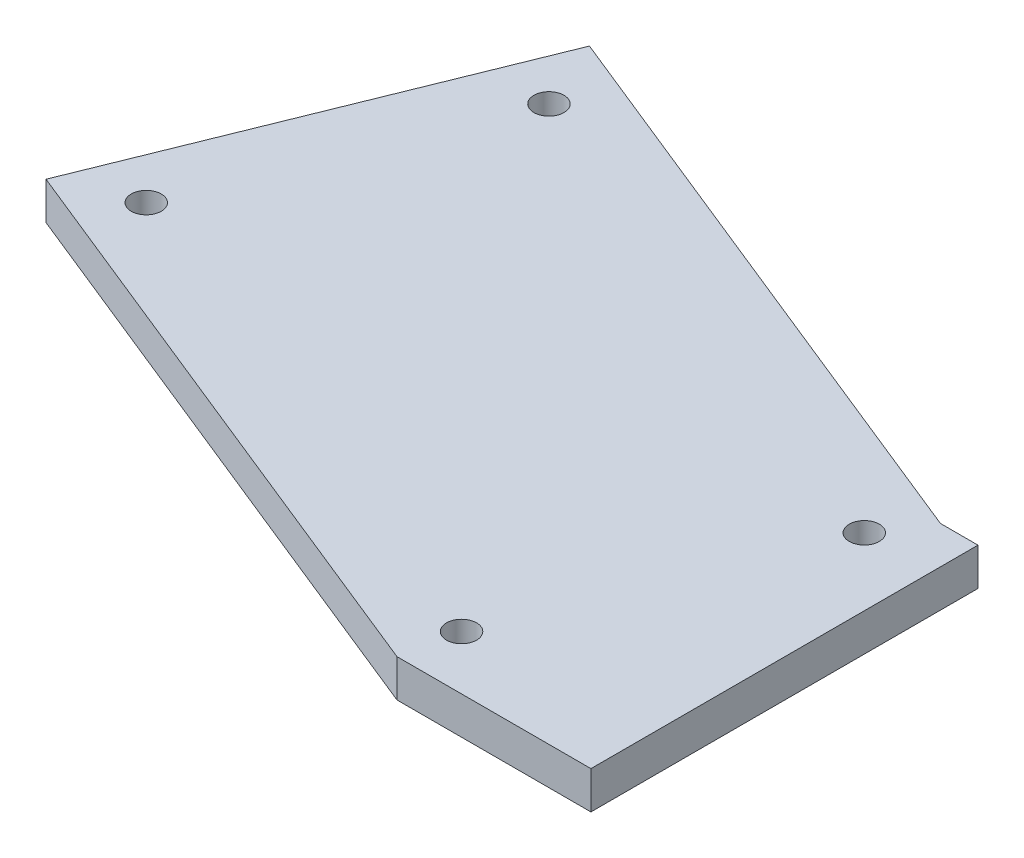
ISO-10303-21;
HEADER;
FILE_DESCRIPTION(('STEP AP214'),'2;1');
FILE_NAME('part.step','',(''),(''),'','','');
FILE_SCHEMA(('AUTOMOTIVE_DESIGN { 1 0 10303 214 1 1 1 1 }'));
ENDSEC;
DATA;
#1=APPLICATION_CONTEXT('core data for automotive mechanical design processes');
#2=APPLICATION_PROTOCOL_DEFINITION('international standard','automotive_design',2000,#1);
#3=PRODUCT_CONTEXT('',#1,'mechanical');
#4=PRODUCT('Part','Part','',(#3));
#5=PRODUCT_RELATED_PRODUCT_CATEGORY('part','',(#4));
#6=PRODUCT_DEFINITION_FORMATION('','',#4);
#7=PRODUCT_DEFINITION_CONTEXT('part definition',#1,'design');
#8=PRODUCT_DEFINITION('design','',#6,#7);
#9=PRODUCT_DEFINITION_SHAPE('','',#8);
#10=(LENGTH_UNIT() NAMED_UNIT(*) SI_UNIT(.MILLI.,.METRE.));
#11=(NAMED_UNIT(*) PLANE_ANGLE_UNIT() SI_UNIT($,.RADIAN.));
#12=(NAMED_UNIT(*) SI_UNIT($,.STERADIAN.) SOLID_ANGLE_UNIT());
#13=UNCERTAINTY_MEASURE_WITH_UNIT(LENGTH_MEASURE(1.E-05),#10,'distance_accuracy_value','');
#14=(GEOMETRIC_REPRESENTATION_CONTEXT(3) GLOBAL_UNCERTAINTY_ASSIGNED_CONTEXT((#13)) GLOBAL_UNIT_ASSIGNED_CONTEXT((#10,
#11,#12)) REPRESENTATION_CONTEXT('',''));
#15=CARTESIAN_POINT('',(0.,0.,0.));
#16=DIRECTION('',(0.,0.,1.));
#17=DIRECTION('',(1.,0.,0.));
#18=AXIS2_PLACEMENT_3D('',#15,#16,#17);
#19=CARTESIAN_POINT('',(0.,3.175,0.));
#20=DIRECTION('',(0.,-1.,0.));
#21=DIRECTION('',(0.,0.,-1.));
#22=AXIS2_PLACEMENT_3D('',#19,#20,#21);
#23=PLANE('',#22);
#24=CARTESIAN_POINT('',(-15.5121536137644,3.175,28.1631531693351));
#25=DIRECTION('',(0.,1.,0.));
#26=DIRECTION('',(0.,0.,1.));
#27=AXIS2_PLACEMENT_3D('',#24,#25,#26);
#28=CIRCLE('',#27,1.27);
#29=CARTESIAN_POINT('',(-15.5121536137644,3.175,29.4331531693351));
#30=VERTEX_POINT('',#29);
#31=EDGE_CURVE('E210',#30,#30,#28,.T.);
#32=ORIENTED_EDGE('',*,*,#31,.F.);
#33=EDGE_LOOP('',(#32));
#34=FACE_BOUND('',#33,.T.);
#35=CARTESIAN_POINT('',(-50.4575887382106,3.175,-14.1723450320931));
#36=DIRECTION('',(0.,1.,0.));
#37=DIRECTION('',(0.,0.,1.));
#38=AXIS2_PLACEMENT_3D('',#35,#36,#37);
#39=CIRCLE('',#38,1.27000000000001);
#40=CARTESIAN_POINT('',(-50.4575887382106,3.175,-12.902345032093));
#41=VERTEX_POINT('',#40);
#42=EDGE_CURVE('E132',#41,#41,#39,.T.);
#43=ORIENTED_EDGE('',*,*,#42,.F.);
#44=EDGE_LOOP('',(#43));
#45=FACE_BOUND('',#44,.T.);
#46=DIRECTION('',(0.,0.,-1.));
#47=VECTOR('',#46,1.);
#48=CARTESIAN_POINT('',(0.,3.175,0.));
#49=LINE('',#48,#47);
#50=CARTESIAN_POINT('',(0.,3.175,32.7351531693348));
#51=VERTEX_POINT('',#50);
#52=CARTESIAN_POINT('',(0.,3.175,0.));
#53=VERTEX_POINT('',#52);
#54=EDGE_CURVE('E141',#51,#53,#49,.T.);
#55=ORIENTED_EDGE('',*,*,#54,.T.);
#56=DIRECTION('',(-1.,0.,0.));
#57=VECTOR('',#56,1.);
#58=CARTESIAN_POINT('',(0.,3.175,0.));
#59=LINE('',#58,#57);
#60=CARTESIAN_POINT('',(-3.175,3.175,0.));
#61=VERTEX_POINT('',#60);
#62=EDGE_CURVE('E94',#53,#61,#59,.T.);
#63=ORIENTED_EDGE('',*,*,#62,.T.);
#64=DIRECTION('',(-0.927183854566788,0.,-0.374606593415909));
#65=VECTOR('',#64,1.);
#66=CARTESIAN_POINT('',(-3.175,3.175,0.));
#67=LINE('',#66,#65);
#68=CARTESIAN_POINT('',(-52.9839719761924,3.175,-20.12413096027));
#69=VERTEX_POINT('',#68);
#70=EDGE_CURVE('E107',#61,#69,#67,.T.);
#71=ORIENTED_EDGE('',*,*,#70,.T.);
#72=DIRECTION('',(-0.374606593415909,0.,0.927183854566789));
#73=VECTOR('',#72,1.);
#74=CARTESIAN_POINT('',(-52.9839719761924,3.175,-20.12413096027));
#75=LINE('',#74,#73);
#76=CARTESIAN_POINT('',(-66.2098323633345,3.175,12.6110222090651));
#77=VERTEX_POINT('',#76);
#78=EDGE_CURVE('E101',#69,#77,#75,.T.);
#79=ORIENTED_EDGE('',*,*,#78,.T.);
#80=DIRECTION('',(0.927183854566788,0.,0.37460659341591));
#81=VECTOR('',#80,1.);
#82=CARTESIAN_POINT('',(-66.2098323633345,3.175,12.6110222090651));
#83=LINE('',#82,#81);
#84=CARTESIAN_POINT('',(-16.4008603871421,3.175,32.7351531693351));
#85=VERTEX_POINT('',#84);
#86=EDGE_CURVE('E105',#77,#85,#83,.T.);
#87=ORIENTED_EDGE('',*,*,#86,.T.);
#88=DIRECTION('',(1.,0.,0.));
#89=VECTOR('',#88,1.);
#90=CARTESIAN_POINT('',(0.,3.175,32.7351531693348));
#91=LINE('',#90,#89);
#92=EDGE_CURVE('E57',#85,#51,#91,.T.);
#93=ORIENTED_EDGE('',*,*,#92,.T.);
#94=EDGE_LOOP('',(#55,#63,#71,#79,#87,#93));
#95=FACE_BOUND('',#94,.T.);
#96=CARTESIAN_POINT('',(-60.2580464351576,3.175,10.0846389710833));
#97=DIRECTION('',(0.,1.,0.));
#98=DIRECTION('',(0.,0.,1.));
#99=AXIS2_PLACEMENT_3D('',#96,#97,#98);
#100=CIRCLE('',#99,1.27000000000006);
#101=CARTESIAN_POINT('',(-60.2580464351576,3.175,11.3546389710833));
#102=VERTEX_POINT('',#101);
#103=EDGE_CURVE('E216',#102,#102,#100,.T.);
#104=ORIENTED_EDGE('',*,*,#103,.F.);
#105=EDGE_LOOP('',(#104));
#106=FACE_BOUND('',#105,.T.);
#107=CARTESIAN_POINT('',(-5.7116959168174,3.175,3.90616916615873));
#108=DIRECTION('',(0.,1.,0.));
#109=DIRECTION('',(0.,0.,1.));
#110=AXIS2_PLACEMENT_3D('',#107,#108,#109);
#111=CIRCLE('',#110,1.27);
#112=CARTESIAN_POINT('',(-5.7116959168174,3.175,5.17616916615873));
#113=VERTEX_POINT('',#112);
#114=EDGE_CURVE('E198',#113,#113,#111,.T.);
#115=ORIENTED_EDGE('',*,*,#114,.F.);
#116=EDGE_LOOP('',(#115));
#117=FACE_BOUND('',#116,.T.);
#118=ADVANCED_FACE('F39',(#34,#45,#95,#106,#117),#23,.F.);
#119=CARTESIAN_POINT('',(0.,0.,0.));
#120=DIRECTION('',(0.,-1.,0.));
#121=DIRECTION('',(0.,0.,-1.));
#122=AXIS2_PLACEMENT_3D('',#119,#120,#121);
#123=PLANE('',#122);
#124=CARTESIAN_POINT('',(-15.5121536137644,0.,28.1631531693351));
#125=DIRECTION('',(0.,1.,0.));
#126=DIRECTION('',(0.,0.,1.));
#127=AXIS2_PLACEMENT_3D('',#124,#125,#126);
#128=CIRCLE('',#127,1.27);
#129=CARTESIAN_POINT('',(-15.5121536137644,0.,29.4331531693351));
#130=VERTEX_POINT('',#129);
#131=EDGE_CURVE('E207',#130,#130,#128,.T.);
#132=ORIENTED_EDGE('',*,*,#131,.T.);
#133=EDGE_LOOP('',(#132));
#134=FACE_BOUND('',#133,.T.);
#135=CARTESIAN_POINT('',(-50.4575887382106,0.,-14.1723450320931));
#136=DIRECTION('',(0.,1.,0.));
#137=DIRECTION('',(0.,0.,1.));
#138=AXIS2_PLACEMENT_3D('',#135,#136,#137);
#139=CIRCLE('',#138,1.27000000000001);
#140=CARTESIAN_POINT('',(-50.4575887382106,0.,-12.902345032093));
#141=VERTEX_POINT('',#140);
#142=EDGE_CURVE('E219',#141,#141,#139,.T.);
#143=ORIENTED_EDGE('',*,*,#142,.T.);
#144=EDGE_LOOP('',(#143));
#145=FACE_BOUND('',#144,.T.);
#146=DIRECTION('',(0.,0.,-1.));
#147=VECTOR('',#146,1.);
#148=CARTESIAN_POINT('',(0.,0.,0.));
#149=LINE('',#148,#147);
#150=CARTESIAN_POINT('',(0.,0.,32.7351531693348));
#151=VERTEX_POINT('',#150);
#152=CARTESIAN_POINT('',(0.,0.,0.));
#153=VERTEX_POINT('',#152);
#154=EDGE_CURVE('E127',#151,#153,#149,.T.);
#155=ORIENTED_EDGE('',*,*,#154,.F.);
#156=DIRECTION('',(1.,0.,0.));
#157=VECTOR('',#156,1.);
#158=CARTESIAN_POINT('',(0.,0.,32.7351531693348));
#159=LINE('',#158,#157);
#160=CARTESIAN_POINT('',(-16.4008603871421,0.,32.7351531693351));
#161=VERTEX_POINT('',#160);
#162=EDGE_CURVE('E86',#161,#151,#159,.T.);
#163=ORIENTED_EDGE('',*,*,#162,.F.);
#164=DIRECTION('',(0.927183854566788,0.,0.37460659341591));
#165=VECTOR('',#164,1.);
#166=CARTESIAN_POINT('',(-66.2098323633345,0.,12.6110222090651));
#167=LINE('',#166,#165);
#168=CARTESIAN_POINT('',(-66.2098323633345,0.,12.6110222090651));
#169=VERTEX_POINT('',#168);
#170=EDGE_CURVE('E80',#169,#161,#167,.T.);
#171=ORIENTED_EDGE('',*,*,#170,.F.);
#172=DIRECTION('',(-0.374606593415909,0.,0.927183854566789));
#173=VECTOR('',#172,1.);
#174=CARTESIAN_POINT('',(-52.9839719761924,0.,-20.12413096027));
#175=LINE('',#174,#173);
#176=CARTESIAN_POINT('',(-52.9839719761924,0.,-20.12413096027));
#177=VERTEX_POINT('',#176);
#178=EDGE_CURVE('E115',#177,#169,#175,.T.);
#179=ORIENTED_EDGE('',*,*,#178,.F.);
#180=DIRECTION('',(-0.927183854566788,0.,-0.374606593415909));
#181=VECTOR('',#180,1.);
#182=CARTESIAN_POINT('',(-3.175,0.,0.));
#183=LINE('',#182,#181);
#184=CARTESIAN_POINT('',(-3.175,0.,0.));
#185=VERTEX_POINT('',#184);
#186=EDGE_CURVE('E135',#185,#177,#183,.T.);
#187=ORIENTED_EDGE('',*,*,#186,.F.);
#188=DIRECTION('',(-1.,0.,0.));
#189=VECTOR('',#188,1.);
#190=CARTESIAN_POINT('',(0.,0.,0.));
#191=LINE('',#190,#189);
#192=EDGE_CURVE('E131',#153,#185,#191,.T.);
#193=ORIENTED_EDGE('',*,*,#192,.F.);
#194=EDGE_LOOP('',(#155,#163,#171,#179,#187,#193));
#195=FACE_BOUND('',#194,.T.);
#196=CARTESIAN_POINT('',(-60.2580464351576,0.,10.0846389710833));
#197=DIRECTION('',(0.,1.,0.));
#198=DIRECTION('',(0.,0.,1.));
#199=AXIS2_PLACEMENT_3D('',#196,#197,#198);
#200=CIRCLE('',#199,1.27000000000006);
#201=CARTESIAN_POINT('',(-60.2580464351576,0.,11.3546389710833));
#202=VERTEX_POINT('',#201);
#203=EDGE_CURVE('E213',#202,#202,#200,.T.);
#204=ORIENTED_EDGE('',*,*,#203,.T.);
#205=EDGE_LOOP('',(#204));
#206=FACE_BOUND('',#205,.T.);
#207=CARTESIAN_POINT('',(-5.7116959168174,0.,3.90616916615873));
#208=DIRECTION('',(0.,1.,0.));
#209=DIRECTION('',(0.,0.,1.));
#210=AXIS2_PLACEMENT_3D('',#207,#208,#209);
#211=CIRCLE('',#210,1.27);
#212=CARTESIAN_POINT('',(-5.7116959168174,0.,5.17616916615873));
#213=VERTEX_POINT('',#212);
#214=EDGE_CURVE('E201',#213,#213,#211,.T.);
#215=ORIENTED_EDGE('',*,*,#214,.T.);
#216=EDGE_LOOP('',(#215));
#217=FACE_BOUND('',#216,.T.);
#218=ADVANCED_FACE('F155',(#134,#145,#195,#206,#217),#123,.T.);
#219=CARTESIAN_POINT('',(0.,3.175,0.));
#220=DIRECTION('',(-1.,0.,0.));
#221=DIRECTION('',(0.,0.,1.));
#222=AXIS2_PLACEMENT_3D('',#219,#220,#221);
#223=PLANE('',#222);
#224=ORIENTED_EDGE('',*,*,#154,.T.);
#225=DIRECTION('',(0.,-1.,0.));
#226=VECTOR('',#225,1.);
#227=CARTESIAN_POINT('',(0.,3.175,0.));
#228=LINE('',#227,#226);
#229=EDGE_CURVE('E11',#53,#153,#228,.T.);
#230=ORIENTED_EDGE('',*,*,#229,.F.);
#231=ORIENTED_EDGE('',*,*,#54,.F.);
#232=DIRECTION('',(0.,-1.,0.));
#233=VECTOR('',#232,1.);
#234=CARTESIAN_POINT('',(0.,3.175,32.7351531693348));
#235=LINE('',#234,#233);
#236=EDGE_CURVE('E123',#51,#151,#235,.T.);
#237=ORIENTED_EDGE('',*,*,#236,.T.);
#238=EDGE_LOOP('',(#224,#230,#231,#237));
#239=FACE_BOUND('',#238,.T.);
#240=ADVANCED_FACE('F41',(#239),#223,.F.);
#241=CARTESIAN_POINT('',(0.,3.175,0.));
#242=DIRECTION('',(0.,0.,1.));
#243=DIRECTION('',(1.,0.,0.));
#244=AXIS2_PLACEMENT_3D('',#241,#242,#243);
#245=PLANE('',#244);
#246=ORIENTED_EDGE('',*,*,#192,.T.);
#247=DIRECTION('',(0.,-1.,0.));
#248=VECTOR('',#247,1.);
#249=CARTESIAN_POINT('',(-3.175,3.175,0.));
#250=LINE('',#249,#248);
#251=EDGE_CURVE('E49',#61,#185,#250,.T.);
#252=ORIENTED_EDGE('',*,*,#251,.F.);
#253=ORIENTED_EDGE('',*,*,#62,.F.);
#254=ORIENTED_EDGE('',*,*,#229,.T.);
#255=EDGE_LOOP('',(#246,#252,#253,#254));
#256=FACE_BOUND('',#255,.T.);
#257=ADVANCED_FACE('F283',(#256),#245,.F.);
#258=CARTESIAN_POINT('',(-3.175,3.175,0.));
#259=DIRECTION('',(-0.374606593415909,0.,0.927183854566788));
#260=DIRECTION('',(0.927183854566789,0.,0.37460659341591));
#261=AXIS2_PLACEMENT_3D('',#258,#259,#260);
#262=PLANE('',#261);
#263=ORIENTED_EDGE('',*,*,#186,.T.);
#264=DIRECTION('',(0.,-1.,0.));
#265=VECTOR('',#264,1.);
#266=CARTESIAN_POINT('',(-52.9839719761924,3.175,-20.12413096027));
#267=LINE('',#266,#265);
#268=EDGE_CURVE('E117',#69,#177,#267,.T.);
#269=ORIENTED_EDGE('',*,*,#268,.F.);
#270=ORIENTED_EDGE('',*,*,#70,.F.);
#271=ORIENTED_EDGE('',*,*,#251,.T.);
#272=EDGE_LOOP('',(#263,#269,#270,#271));
#273=FACE_BOUND('',#272,.T.);
#274=ADVANCED_FACE('F152',(#273),#262,.F.);
#275=CARTESIAN_POINT('',(-52.9839719761924,3.175,-20.12413096027));
#276=DIRECTION('',(0.927183854566789,0.,0.374606593415909));
#277=DIRECTION('',(0.374606593415909,0.,-0.927183854566789));
#278=AXIS2_PLACEMENT_3D('',#275,#276,#277);
#279=PLANE('',#278);
#280=ORIENTED_EDGE('',*,*,#178,.T.);
#281=DIRECTION('',(0.,-1.,0.));
#282=VECTOR('',#281,1.);
#283=CARTESIAN_POINT('',(-66.2098323633345,3.175,12.6110222090651));
#284=LINE('',#283,#282);
#285=EDGE_CURVE('E112',#77,#169,#284,.T.);
#286=ORIENTED_EDGE('',*,*,#285,.F.);
#287=ORIENTED_EDGE('',*,*,#78,.F.);
#288=ORIENTED_EDGE('',*,*,#268,.T.);
#289=EDGE_LOOP('',(#280,#286,#287,#288));
#290=FACE_BOUND('',#289,.T.);
#291=ADVANCED_FACE('F113',(#290),#279,.F.);
#292=CARTESIAN_POINT('',(-66.2098323633345,3.175,12.6110222090651));
#293=DIRECTION('',(0.37460659341591,0.,-0.927183854566788));
#294=DIRECTION('',(-0.927183854566788,0.,-0.37460659341591));
#295=AXIS2_PLACEMENT_3D('',#292,#293,#294);
#296=PLANE('',#295);
#297=ORIENTED_EDGE('',*,*,#170,.T.);
#298=DIRECTION('',(0.,-1.,0.));
#299=VECTOR('',#298,1.);
#300=CARTESIAN_POINT('',(-16.4008603871421,3.175,32.7351531693351));
#301=LINE('',#300,#299);
#302=EDGE_CURVE('E118',#85,#161,#301,.T.);
#303=ORIENTED_EDGE('',*,*,#302,.F.);
#304=ORIENTED_EDGE('',*,*,#86,.F.);
#305=ORIENTED_EDGE('',*,*,#285,.T.);
#306=EDGE_LOOP('',(#297,#303,#304,#305));
#307=FACE_BOUND('',#306,.T.);
#308=ADVANCED_FACE('F120',(#307),#296,.F.);
#309=CARTESIAN_POINT('',(0.,3.175,32.7351531693348));
#310=DIRECTION('',(0.,0.,-1.));
#311=DIRECTION('',(-1.,0.,0.));
#312=AXIS2_PLACEMENT_3D('',#309,#310,#311);
#313=PLANE('',#312);
#314=ORIENTED_EDGE('',*,*,#162,.T.);
#315=ORIENTED_EDGE('',*,*,#236,.F.);
#316=ORIENTED_EDGE('',*,*,#92,.F.);
#317=ORIENTED_EDGE('',*,*,#302,.T.);
#318=EDGE_LOOP('',(#314,#315,#316,#317));
#319=FACE_BOUND('',#318,.T.);
#320=ADVANCED_FACE('F160',(#319),#313,.F.);
#321=CARTESIAN_POINT('',(-50.4575887382106,3.175,-14.1723450320931));
#322=DIRECTION('',(0.,-1.,0.));
#323=DIRECTION('',(0.,0.,-1.));
#324=AXIS2_PLACEMENT_3D('',#321,#322,#323);
#325=CYLINDRICAL_SURFACE('',#324,1.27000000000001);
#326=ORIENTED_EDGE('',*,*,#42,.T.);
#327=EDGE_LOOP('',(#326));
#328=FACE_BOUND('',#327,.T.);
#329=ORIENTED_EDGE('',*,*,#142,.F.);
#330=EDGE_LOOP('',(#329));
#331=FACE_BOUND('',#330,.T.);
#332=ADVANCED_FACE('F162',(#328,#331),#325,.F.);
#333=CARTESIAN_POINT('',(-60.2580464351576,3.175,10.0846389710833));
#334=DIRECTION('',(0.,-1.,0.));
#335=DIRECTION('',(0.,0.,-1.));
#336=AXIS2_PLACEMENT_3D('',#333,#334,#335);
#337=CYLINDRICAL_SURFACE('',#336,1.27000000000006);
#338=ORIENTED_EDGE('',*,*,#103,.T.);
#339=EDGE_LOOP('',(#338));
#340=FACE_BOUND('',#339,.T.);
#341=ORIENTED_EDGE('',*,*,#203,.F.);
#342=EDGE_LOOP('',(#341));
#343=FACE_BOUND('',#342,.T.);
#344=ADVANCED_FACE('F168',(#340,#343),#337,.F.);
#345=CARTESIAN_POINT('',(-15.5121536137644,3.175,28.1631531693351));
#346=DIRECTION('',(0.,-1.,0.));
#347=DIRECTION('',(0.,0.,-1.));
#348=AXIS2_PLACEMENT_3D('',#345,#346,#347);
#349=CYLINDRICAL_SURFACE('',#348,1.27);
#350=ORIENTED_EDGE('',*,*,#31,.T.);
#351=EDGE_LOOP('',(#350));
#352=FACE_BOUND('',#351,.T.);
#353=ORIENTED_EDGE('',*,*,#131,.F.);
#354=EDGE_LOOP('',(#353));
#355=FACE_BOUND('',#354,.T.);
#356=ADVANCED_FACE('F185',(#352,#355),#349,.F.);
#357=CARTESIAN_POINT('',(-5.7116959168174,3.175,3.90616916615873));
#358=DIRECTION('',(0.,-1.,0.));
#359=DIRECTION('',(0.,0.,-1.));
#360=AXIS2_PLACEMENT_3D('',#357,#358,#359);
#361=CYLINDRICAL_SURFACE('',#360,1.27);
#362=ORIENTED_EDGE('',*,*,#114,.T.);
#363=EDGE_LOOP('',(#362));
#364=FACE_BOUND('',#363,.T.);
#365=ORIENTED_EDGE('',*,*,#214,.F.);
#366=EDGE_LOOP('',(#365));
#367=FACE_BOUND('',#366,.T.);
#368=ADVANCED_FACE('F189',(#364,#367),#361,.F.);
#369=CLOSED_SHELL('',(#118,#218,#240,#257,#274,#291,#308,#320,#332,#344,#356,#368));
#370=MANIFOLD_SOLID_BREP('B2',#369);
#371=ADVANCED_BREP_SHAPE_REPRESENTATION('',(#18,#370),#14);
#372=SHAPE_DEFINITION_REPRESENTATION(#9,#371);
ENDSEC;
END-ISO-10303-21;
